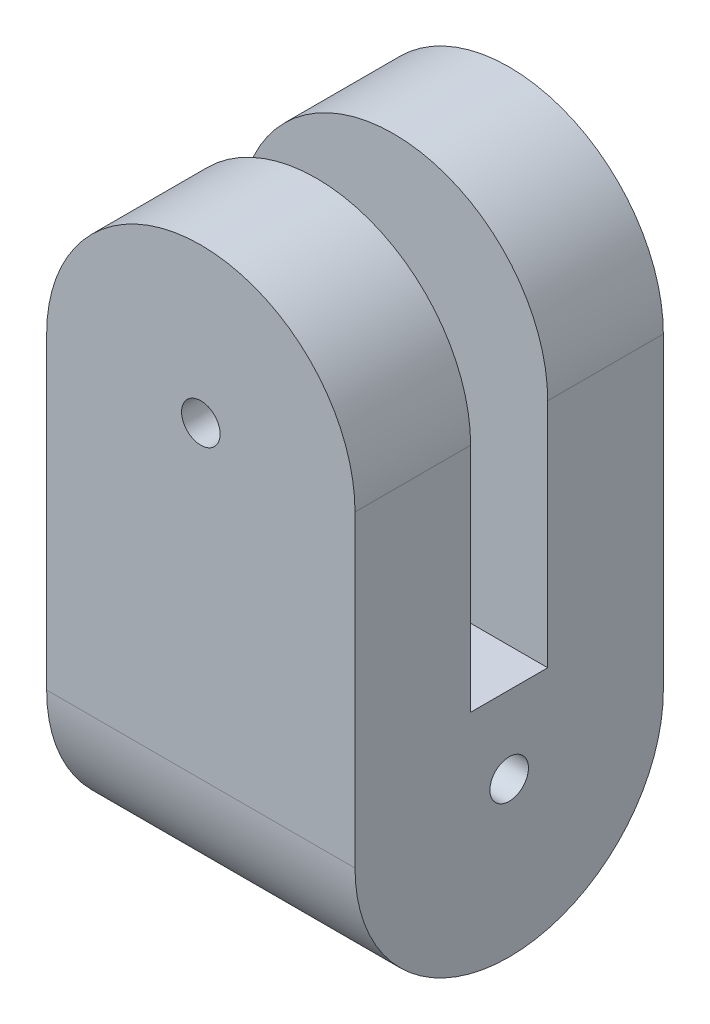
ISO-10303-21;
HEADER;
FILE_DESCRIPTION(('STEP AP214'),'2;1');
FILE_NAME('part.step','',(''),(''),'','','');
FILE_SCHEMA(('AUTOMOTIVE_DESIGN { 1 0 10303 214 1 1 1 1 }'));
ENDSEC;
DATA;
#1=APPLICATION_CONTEXT('core data for automotive mechanical design processes');
#2=APPLICATION_PROTOCOL_DEFINITION('international standard','automotive_design',2000,#1);
#3=PRODUCT_CONTEXT('',#1,'mechanical');
#4=PRODUCT('Part','Part','',(#3));
#5=PRODUCT_RELATED_PRODUCT_CATEGORY('part','',(#4));
#6=PRODUCT_DEFINITION_FORMATION('','',#4);
#7=PRODUCT_DEFINITION_CONTEXT('part definition',#1,'design');
#8=PRODUCT_DEFINITION('design','',#6,#7);
#9=PRODUCT_DEFINITION_SHAPE('','',#8);
#10=(LENGTH_UNIT() NAMED_UNIT(*) SI_UNIT(.MILLI.,.METRE.));
#11=(NAMED_UNIT(*) PLANE_ANGLE_UNIT() SI_UNIT($,.RADIAN.));
#12=(NAMED_UNIT(*) SI_UNIT($,.STERADIAN.) SOLID_ANGLE_UNIT());
#13=UNCERTAINTY_MEASURE_WITH_UNIT(LENGTH_MEASURE(1.E-05),#10,'distance_accuracy_value','');
#14=(GEOMETRIC_REPRESENTATION_CONTEXT(3) GLOBAL_UNCERTAINTY_ASSIGNED_CONTEXT((#13)) GLOBAL_UNIT_ASSIGNED_CONTEXT((#10,
#11,#12)) REPRESENTATION_CONTEXT('',''));
#15=CARTESIAN_POINT('',(0.,0.,0.));
#16=DIRECTION('',(0.,0.,1.));
#17=DIRECTION('',(1.,0.,0.));
#18=AXIS2_PLACEMENT_3D('',#15,#16,#17);
#19=CARTESIAN_POINT('',(10.,20.,20.));
#20=DIRECTION('',(0.,0.,-1.));
#21=DIRECTION('',(-1.,0.,0.));
#22=AXIS2_PLACEMENT_3D('',#19,#20,#21);
#23=CYLINDRICAL_SURFACE('',#22,10.);
#24=CARTESIAN_POINT('',(10.,20.,12.5));
#25=DIRECTION('',(0.,0.,1.));
#26=DIRECTION('',(0.,-1.,0.));
#27=AXIS2_PLACEMENT_3D('',#24,#25,#26);
#28=CIRCLE('',#27,10.);
#29=CARTESIAN_POINT('',(20.,20.,12.5));
#30=VERTEX_POINT('',#29);
#31=CARTESIAN_POINT('',(0.,20.,12.5));
#32=VERTEX_POINT('',#31);
#33=EDGE_CURVE('E165',#30,#32,#28,.T.);
#34=ORIENTED_EDGE('',*,*,#33,.T.);
#35=DIRECTION('',(0.,0.,-1.));
#36=VECTOR('',#35,1.);
#37=CARTESIAN_POINT('',(0.,20.,20.));
#38=LINE('',#37,#36);
#39=CARTESIAN_POINT('',(0.,20.,20.));
#40=VERTEX_POINT('',#39);
#41=EDGE_CURVE('E178',#40,#32,#38,.T.);
#42=ORIENTED_EDGE('',*,*,#41,.F.);
#43=CARTESIAN_POINT('',(10.,20.,20.));
#44=DIRECTION('',(0.,0.,1.));
#45=DIRECTION('',(1.,0.,0.));
#46=AXIS2_PLACEMENT_3D('',#43,#44,#45);
#47=CIRCLE('',#46,10.);
#48=CARTESIAN_POINT('',(20.,20.,20.));
#49=VERTEX_POINT('',#48);
#50=EDGE_CURVE('E87',#49,#40,#47,.T.);
#51=ORIENTED_EDGE('',*,*,#50,.F.);
#52=DIRECTION('',(0.,0.,-1.));
#53=VECTOR('',#52,1.);
#54=CARTESIAN_POINT('',(20.,20.,20.));
#55=LINE('',#54,#53);
#56=EDGE_CURVE('E44',#49,#30,#55,.T.);
#57=ORIENTED_EDGE('',*,*,#56,.T.);
#58=EDGE_LOOP('',(#34,#42,#51,#57));
#59=FACE_BOUND('',#58,.T.);
#60=ADVANCED_FACE('F35',(#59),#23,.T.);
#61=CARTESIAN_POINT('',(20.,0.,20.));
#62=DIRECTION('',(-1.,0.,0.));
#63=DIRECTION('',(0.,0.,1.));
#64=AXIS2_PLACEMENT_3D('',#61,#62,#63);
#65=PLANE('',#64);
#66=CARTESIAN_POINT('',(20.,0.,10.));
#67=DIRECTION('',(-1.,0.,0.));
#68=DIRECTION('',(0.,0.,1.));
#69=AXIS2_PLACEMENT_3D('',#66,#67,#68);
#70=CIRCLE('',#69,1.25);
#71=CARTESIAN_POINT('',(20.,0.,11.25));
#72=VERTEX_POINT('',#71);
#73=EDGE_CURVE('E132',#72,#72,#70,.T.);
#74=ORIENTED_EDGE('',*,*,#73,.T.);
#75=EDGE_LOOP('',(#74));
#76=FACE_BOUND('',#75,.T.);
#77=DIRECTION('',(0.,0.,1.));
#78=VECTOR('',#77,1.);
#79=CARTESIAN_POINT('',(20.,5.,20.));
#80=LINE('',#79,#78);
#81=CARTESIAN_POINT('',(20.,5.,7.5));
#82=VERTEX_POINT('',#81);
#83=CARTESIAN_POINT('',(20.,5.,12.5));
#84=VERTEX_POINT('',#83);
#85=EDGE_CURVE('E155',#82,#84,#80,.T.);
#86=ORIENTED_EDGE('',*,*,#85,.T.);
#87=DIRECTION('',(0.,1.,0.));
#88=VECTOR('',#87,1.);
#89=CARTESIAN_POINT('',(20.,0.,12.5));
#90=LINE('',#89,#88);
#91=EDGE_CURVE('E118',#84,#30,#90,.T.);
#92=ORIENTED_EDGE('',*,*,#91,.T.);
#93=ORIENTED_EDGE('',*,*,#56,.F.);
#94=DIRECTION('',(0.,1.,0.));
#95=VECTOR('',#94,1.);
#96=CARTESIAN_POINT('',(20.,0.,20.));
#97=LINE('',#96,#95);
#98=CARTESIAN_POINT('',(20.,0.,20.));
#99=VERTEX_POINT('',#98);
#100=EDGE_CURVE('E127',#99,#49,#97,.T.);
#101=ORIENTED_EDGE('',*,*,#100,.F.);
#102=CARTESIAN_POINT('',(20.,0.,10.));
#103=DIRECTION('',(1.,0.,0.));
#104=DIRECTION('',(0.,0.,-1.));
#105=AXIS2_PLACEMENT_3D('',#102,#103,#104);
#106=CIRCLE('',#105,10.);
#107=CARTESIAN_POINT('',(20.,0.,0.));
#108=VERTEX_POINT('',#107);
#109=EDGE_CURVE('E124',#99,#108,#106,.T.);
#110=ORIENTED_EDGE('',*,*,#109,.T.);
#111=DIRECTION('',(0.,1.,0.));
#112=VECTOR('',#111,1.);
#113=CARTESIAN_POINT('',(20.,0.,0.));
#114=LINE('',#113,#112);
#115=CARTESIAN_POINT('',(20.,20.,0.));
#116=VERTEX_POINT('',#115);
#117=EDGE_CURVE('E111',#108,#116,#114,.T.);
#118=ORIENTED_EDGE('',*,*,#117,.T.);
#119=CARTESIAN_POINT('',(20.,20.,7.5));
#120=VERTEX_POINT('',#119);
#121=EDGE_CURVE('E181',#120,#116,#55,.T.);
#122=ORIENTED_EDGE('',*,*,#121,.F.);
#123=DIRECTION('',(0.,-1.,0.));
#124=VECTOR('',#123,1.);
#125=CARTESIAN_POINT('',(20.,0.,7.5));
#126=LINE('',#125,#124);
#127=EDGE_CURVE('E162',#120,#82,#126,.T.);
#128=ORIENTED_EDGE('',*,*,#127,.T.);
#129=EDGE_LOOP('',(#86,#92,#93,#101,#110,#118,#122,#128));
#130=FACE_BOUND('',#129,.T.);
#131=ADVANCED_FACE('F37',(#76,#130),#65,.F.);
#132=CARTESIAN_POINT('',(0.,20.,7.5));
#133=VERTEX_POINT('',#132);
#134=CARTESIAN_POINT('',(0.,20.,0.));
#135=VERTEX_POINT('',#134);
#136=EDGE_CURVE('E174',#133,#135,#38,.T.);
#137=ORIENTED_EDGE('',*,*,#136,.F.);
#138=CARTESIAN_POINT('',(10.,20.,7.5));
#139=DIRECTION('',(0.,0.,-1.));
#140=DIRECTION('',(-1.,0.,0.));
#141=AXIS2_PLACEMENT_3D('',#138,#139,#140);
#142=CIRCLE('',#141,10.);
#143=EDGE_CURVE('E159',#133,#120,#142,.T.);
#144=ORIENTED_EDGE('',*,*,#143,.T.);
#145=ORIENTED_EDGE('',*,*,#121,.T.);
#146=CARTESIAN_POINT('',(10.,20.,0.));
#147=DIRECTION('',(0.,0.,1.));
#148=DIRECTION('',(1.,0.,0.));
#149=AXIS2_PLACEMENT_3D('',#146,#147,#148);
#150=CIRCLE('',#149,10.);
#151=EDGE_CURVE('E114',#116,#135,#150,.T.);
#152=ORIENTED_EDGE('',*,*,#151,.T.);
#153=EDGE_LOOP('',(#137,#144,#145,#152));
#154=FACE_BOUND('',#153,.T.);
#155=ADVANCED_FACE('F184',(#154),#23,.T.);
#156=CARTESIAN_POINT('',(0.,0.,20.));
#157=DIRECTION('',(-1.,0.,0.));
#158=DIRECTION('',(0.,0.,1.));
#159=AXIS2_PLACEMENT_3D('',#156,#157,#158);
#160=PLANE('',#159);
#161=CARTESIAN_POINT('',(0.,0.,10.));
#162=DIRECTION('',(1.,0.,0.));
#163=DIRECTION('',(0.,0.,-1.));
#164=AXIS2_PLACEMENT_3D('',#161,#162,#163);
#165=CIRCLE('',#164,1.25);
#166=CARTESIAN_POINT('',(0.,0.,8.75));
#167=VERTEX_POINT('',#166);
#168=EDGE_CURVE('E137',#167,#167,#165,.T.);
#169=ORIENTED_EDGE('',*,*,#168,.T.);
#170=EDGE_LOOP('',(#169));
#171=FACE_BOUND('',#170,.T.);
#172=DIRECTION('',(0.,1.,0.));
#173=VECTOR('',#172,1.);
#174=CARTESIAN_POINT('',(0.,0.,12.5));
#175=LINE('',#174,#173);
#176=CARTESIAN_POINT('',(0.,5.,12.5));
#177=VERTEX_POINT('',#176);
#178=EDGE_CURVE('E11',#177,#32,#175,.T.);
#179=ORIENTED_EDGE('',*,*,#178,.F.);
#180=DIRECTION('',(0.,0.,-1.));
#181=VECTOR('',#180,1.);
#182=CARTESIAN_POINT('',(0.,5.,12.5));
#183=LINE('',#182,#181);
#184=CARTESIAN_POINT('',(0.,5.,7.5));
#185=VERTEX_POINT('',#184);
#186=EDGE_CURVE('E148',#177,#185,#183,.T.);
#187=ORIENTED_EDGE('',*,*,#186,.T.);
#188=DIRECTION('',(0.,1.,0.));
#189=VECTOR('',#188,1.);
#190=CARTESIAN_POINT('',(0.,30.,7.5));
#191=LINE('',#190,#189);
#192=EDGE_CURVE('E51',#185,#133,#191,.T.);
#193=ORIENTED_EDGE('',*,*,#192,.T.);
#194=ORIENTED_EDGE('',*,*,#136,.T.);
#195=DIRECTION('',(0.,1.,0.));
#196=VECTOR('',#195,1.);
#197=CARTESIAN_POINT('',(0.,0.,0.));
#198=LINE('',#197,#196);
#199=CARTESIAN_POINT('',(0.,0.,0.));
#200=VERTEX_POINT('',#199);
#201=EDGE_CURVE('E128',#200,#135,#198,.T.);
#202=ORIENTED_EDGE('',*,*,#201,.F.);
#203=CARTESIAN_POINT('',(0.,0.,10.));
#204=DIRECTION('',(1.,0.,0.));
#205=DIRECTION('',(0.,0.,-1.));
#206=AXIS2_PLACEMENT_3D('',#203,#204,#205);
#207=CIRCLE('',#206,10.);
#208=CARTESIAN_POINT('',(0.,0.,20.));
#209=VERTEX_POINT('',#208);
#210=EDGE_CURVE('E126',#209,#200,#207,.T.);
#211=ORIENTED_EDGE('',*,*,#210,.F.);
#212=DIRECTION('',(0.,1.,0.));
#213=VECTOR('',#212,1.);
#214=CARTESIAN_POINT('',(0.,0.,20.));
#215=LINE('',#214,#213);
#216=EDGE_CURVE('E171',#209,#40,#215,.T.);
#217=ORIENTED_EDGE('',*,*,#216,.T.);
#218=ORIENTED_EDGE('',*,*,#41,.T.);
#219=EDGE_LOOP('',(#179,#187,#193,#194,#202,#211,#217,#218));
#220=FACE_BOUND('',#219,.T.);
#221=ADVANCED_FACE('F191',(#171,#220),#160,.T.);
#222=CARTESIAN_POINT('',(10.,20.,20.));
#223=DIRECTION('',(0.,0.,1.));
#224=DIRECTION('',(1.,0.,0.));
#225=AXIS2_PLACEMENT_3D('',#222,#223,#224);
#226=PLANE('',#225);
#227=CARTESIAN_POINT('',(10.,20.,20.));
#228=DIRECTION('',(0.,0.,-1.));
#229=DIRECTION('',(-1.,0.,0.));
#230=AXIS2_PLACEMENT_3D('',#227,#228,#229);
#231=CIRCLE('',#230,1.25);
#232=CARTESIAN_POINT('',(8.75,20.,20.));
#233=VERTEX_POINT('',#232);
#234=EDGE_CURVE('E134',#233,#233,#231,.T.);
#235=ORIENTED_EDGE('',*,*,#234,.T.);
#236=EDGE_LOOP('',(#235));
#237=FACE_BOUND('',#236,.T.);
#238=ORIENTED_EDGE('',*,*,#100,.T.);
#239=ORIENTED_EDGE('',*,*,#50,.T.);
#240=ORIENTED_EDGE('',*,*,#216,.F.);
#241=DIRECTION('',(1.,0.,0.));
#242=VECTOR('',#241,1.);
#243=CARTESIAN_POINT('',(0.,0.,20.));
#244=LINE('',#243,#242);
#245=EDGE_CURVE('E60',#209,#99,#244,.T.);
#246=ORIENTED_EDGE('',*,*,#245,.T.);
#247=EDGE_LOOP('',(#238,#239,#240,#246));
#248=FACE_BOUND('',#247,.T.);
#249=ADVANCED_FACE('F194',(#237,#248),#226,.T.);
#250=CARTESIAN_POINT('',(10.,20.,0.));
#251=DIRECTION('',(0.,0.,1.));
#252=DIRECTION('',(1.,0.,0.));
#253=AXIS2_PLACEMENT_3D('',#250,#251,#252);
#254=PLANE('',#253);
#255=CARTESIAN_POINT('',(10.,20.,0.));
#256=DIRECTION('',(0.,0.,1.));
#257=DIRECTION('',(1.,0.,0.));
#258=AXIS2_PLACEMENT_3D('',#255,#256,#257);
#259=CIRCLE('',#258,1.25);
#260=CARTESIAN_POINT('',(11.25,20.,0.));
#261=VERTEX_POINT('',#260);
#262=EDGE_CURVE('E145',#261,#261,#259,.T.);
#263=ORIENTED_EDGE('',*,*,#262,.T.);
#264=EDGE_LOOP('',(#263));
#265=FACE_BOUND('',#264,.T.);
#266=ORIENTED_EDGE('',*,*,#117,.F.);
#267=DIRECTION('',(1.,0.,0.));
#268=VECTOR('',#267,1.);
#269=CARTESIAN_POINT('',(0.,0.,0.));
#270=LINE('',#269,#268);
#271=EDGE_CURVE('E79',#200,#108,#270,.T.);
#272=ORIENTED_EDGE('',*,*,#271,.F.);
#273=ORIENTED_EDGE('',*,*,#201,.T.);
#274=ORIENTED_EDGE('',*,*,#151,.F.);
#275=EDGE_LOOP('',(#266,#272,#273,#274));
#276=FACE_BOUND('',#275,.T.);
#277=ADVANCED_FACE('F112',(#265,#276),#254,.F.);
#278=CARTESIAN_POINT('',(0.,30.,12.5));
#279=DIRECTION('',(0.,0.,1.));
#280=DIRECTION('',(0.,-1.,0.));
#281=AXIS2_PLACEMENT_3D('',#278,#279,#280);
#282=PLANE('',#281);
#283=CARTESIAN_POINT('',(10.,20.,12.5));
#284=DIRECTION('',(0.,0.,1.));
#285=DIRECTION('',(0.,-1.,0.));
#286=AXIS2_PLACEMENT_3D('',#283,#284,#285);
#287=CIRCLE('',#286,1.25);
#288=CARTESIAN_POINT('',(10.,18.75,12.5));
#289=VERTEX_POINT('',#288);
#290=EDGE_CURVE('E142',#289,#289,#287,.T.);
#291=ORIENTED_EDGE('',*,*,#290,.T.);
#292=EDGE_LOOP('',(#291));
#293=FACE_BOUND('',#292,.T.);
#294=DIRECTION('',(1.,0.,0.));
#295=VECTOR('',#294,1.);
#296=CARTESIAN_POINT('',(0.,5.,12.5));
#297=LINE('',#296,#295);
#298=EDGE_CURVE('E152',#177,#84,#297,.T.);
#299=ORIENTED_EDGE('',*,*,#298,.F.);
#300=ORIENTED_EDGE('',*,*,#178,.T.);
#301=ORIENTED_EDGE('',*,*,#33,.F.);
#302=ORIENTED_EDGE('',*,*,#91,.F.);
#303=EDGE_LOOP('',(#299,#300,#301,#302));
#304=FACE_BOUND('',#303,.T.);
#305=ADVANCED_FACE('F193',(#293,#304),#282,.F.);
#306=CARTESIAN_POINT('',(0.,30.,7.5));
#307=DIRECTION('',(0.,0.,-1.));
#308=DIRECTION('',(-1.,0.,0.));
#309=AXIS2_PLACEMENT_3D('',#306,#307,#308);
#310=PLANE('',#309);
#311=CARTESIAN_POINT('',(10.,20.,7.5));
#312=DIRECTION('',(0.,0.,-1.));
#313=DIRECTION('',(-1.,0.,0.));
#314=AXIS2_PLACEMENT_3D('',#311,#312,#313);
#315=CIRCLE('',#314,1.25);
#316=CARTESIAN_POINT('',(8.75,20.,7.5));
#317=VERTEX_POINT('',#316);
#318=EDGE_CURVE('E39',#317,#317,#315,.T.);
#319=ORIENTED_EDGE('',*,*,#318,.T.);
#320=EDGE_LOOP('',(#319));
#321=FACE_BOUND('',#320,.T.);
#322=ORIENTED_EDGE('',*,*,#143,.F.);
#323=ORIENTED_EDGE('',*,*,#192,.F.);
#324=DIRECTION('',(1.,0.,0.));
#325=VECTOR('',#324,1.);
#326=CARTESIAN_POINT('',(0.,5.,7.5));
#327=LINE('',#326,#325);
#328=EDGE_CURVE('E153',#185,#82,#327,.T.);
#329=ORIENTED_EDGE('',*,*,#328,.T.);
#330=ORIENTED_EDGE('',*,*,#127,.F.);
#331=EDGE_LOOP('',(#322,#323,#329,#330));
#332=FACE_BOUND('',#331,.T.);
#333=ADVANCED_FACE('F185',(#321,#332),#310,.F.);
#334=CARTESIAN_POINT('',(0.,5.,12.5));
#335=DIRECTION('',(0.,-1.,0.));
#336=DIRECTION('',(0.,0.,-1.));
#337=AXIS2_PLACEMENT_3D('',#334,#335,#336);
#338=PLANE('',#337);
#339=ORIENTED_EDGE('',*,*,#328,.F.);
#340=ORIENTED_EDGE('',*,*,#186,.F.);
#341=ORIENTED_EDGE('',*,*,#298,.T.);
#342=ORIENTED_EDGE('',*,*,#85,.F.);
#343=EDGE_LOOP('',(#339,#340,#341,#342));
#344=FACE_BOUND('',#343,.T.);
#345=ADVANCED_FACE('F188',(#344),#338,.F.);
#346=CARTESIAN_POINT('',(10.,20.,20.));
#347=DIRECTION('',(0.,0.,-1.));
#348=DIRECTION('',(-1.,0.,0.));
#349=AXIS2_PLACEMENT_3D('',#346,#347,#348);
#350=CYLINDRICAL_SURFACE('',#349,1.25);
#351=ORIENTED_EDGE('',*,*,#318,.F.);
#352=EDGE_LOOP('',(#351));
#353=FACE_BOUND('',#352,.T.);
#354=ORIENTED_EDGE('',*,*,#262,.F.);
#355=EDGE_LOOP('',(#354));
#356=FACE_BOUND('',#355,.T.);
#357=ADVANCED_FACE('F251',(#353,#356),#350,.F.);
#358=ORIENTED_EDGE('',*,*,#234,.F.);
#359=EDGE_LOOP('',(#358));
#360=FACE_BOUND('',#359,.T.);
#361=ORIENTED_EDGE('',*,*,#290,.F.);
#362=EDGE_LOOP('',(#361));
#363=FACE_BOUND('',#362,.T.);
#364=ADVANCED_FACE('F244',(#360,#363),#350,.F.);
#365=CARTESIAN_POINT('',(0.,0.,10.));
#366=DIRECTION('',(1.,0.,0.));
#367=DIRECTION('',(0.,0.,-1.));
#368=AXIS2_PLACEMENT_3D('',#365,#366,#367);
#369=CYLINDRICAL_SURFACE('',#368,10.);
#370=ORIENTED_EDGE('',*,*,#109,.F.);
#371=ORIENTED_EDGE('',*,*,#245,.F.);
#372=ORIENTED_EDGE('',*,*,#210,.T.);
#373=ORIENTED_EDGE('',*,*,#271,.T.);
#374=EDGE_LOOP('',(#370,#371,#372,#373));
#375=FACE_BOUND('',#374,.T.);
#376=ADVANCED_FACE('F123',(#375),#369,.T.);
#377=CARTESIAN_POINT('',(0.,0.,10.));
#378=DIRECTION('',(1.,0.,0.));
#379=DIRECTION('',(0.,0.,-1.));
#380=AXIS2_PLACEMENT_3D('',#377,#378,#379);
#381=CYLINDRICAL_SURFACE('',#380,1.25);
#382=ORIENTED_EDGE('',*,*,#168,.F.);
#383=EDGE_LOOP('',(#382));
#384=FACE_BOUND('',#383,.T.);
#385=ORIENTED_EDGE('',*,*,#73,.F.);
#386=EDGE_LOOP('',(#385));
#387=FACE_BOUND('',#386,.T.);
#388=ADVANCED_FACE('F232',(#384,#387),#381,.F.);
#389=CLOSED_SHELL('',(#60,#131,#155,#221,#249,#277,#305,#333,#345,#357,#364,#376,#388));
#390=MANIFOLD_SOLID_BREP('B2',#389);
#391=ADVANCED_BREP_SHAPE_REPRESENTATION('',(#18,#390),#14);
#392=SHAPE_DEFINITION_REPRESENTATION(#9,#391);
ENDSEC;
END-ISO-10303-21;
